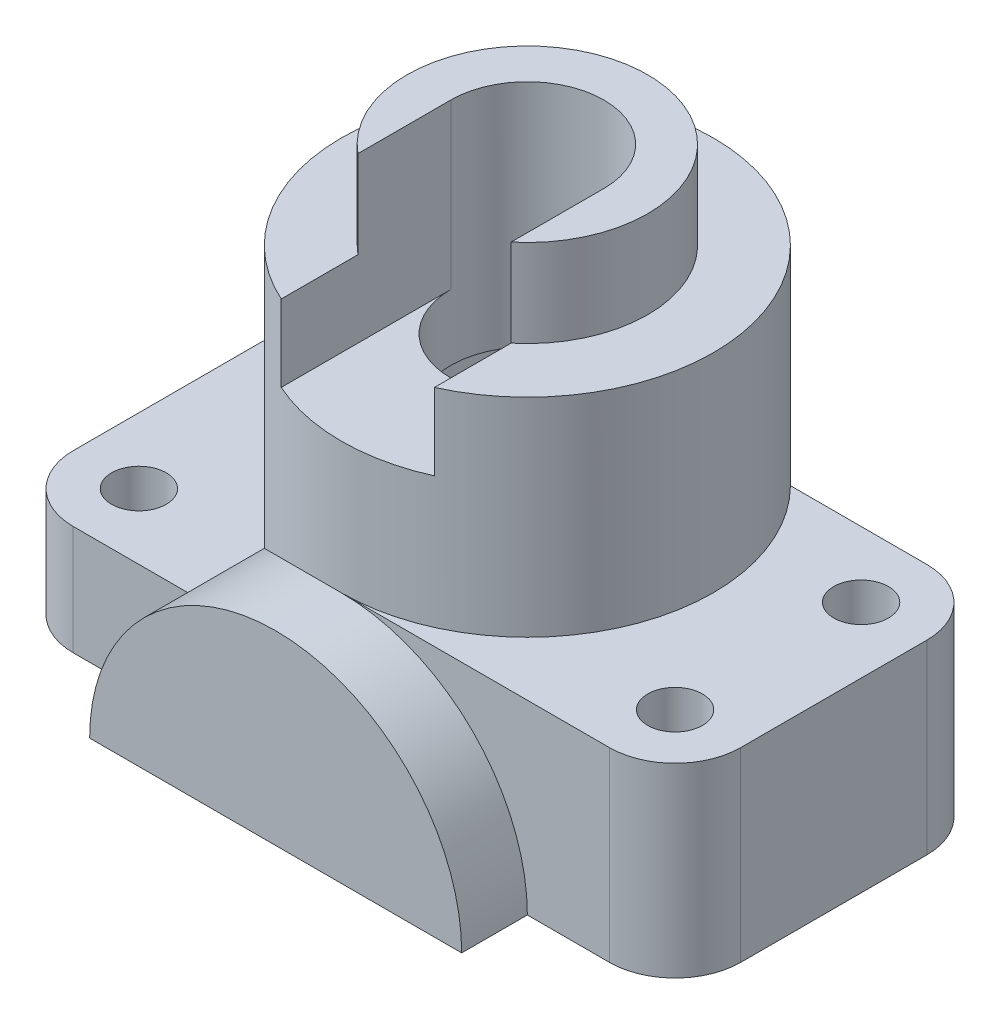
ISO-10303-21;
HEADER;
FILE_DESCRIPTION(('STEP AP214'),'2;1');
FILE_NAME('part.step','',(''),(''),'','','');
FILE_SCHEMA(('AUTOMOTIVE_DESIGN { 1 0 10303 214 1 1 1 1 }'));
ENDSEC;
DATA;
#1=APPLICATION_CONTEXT('core data for automotive mechanical design processes');
#2=APPLICATION_PROTOCOL_DEFINITION('international standard','automotive_design',2000,#1);
#3=PRODUCT_CONTEXT('',#1,'mechanical');
#4=PRODUCT('Part','Part','',(#3));
#5=PRODUCT_RELATED_PRODUCT_CATEGORY('part','',(#4));
#6=PRODUCT_DEFINITION_FORMATION('','',#4);
#7=PRODUCT_DEFINITION_CONTEXT('part definition',#1,'design');
#8=PRODUCT_DEFINITION('design','',#6,#7);
#9=PRODUCT_DEFINITION_SHAPE('','',#8);
#10=(LENGTH_UNIT() NAMED_UNIT(*) SI_UNIT(.MILLI.,.METRE.));
#11=(NAMED_UNIT(*) PLANE_ANGLE_UNIT() SI_UNIT($,.RADIAN.));
#12=(NAMED_UNIT(*) SI_UNIT($,.STERADIAN.) SOLID_ANGLE_UNIT());
#13=UNCERTAINTY_MEASURE_WITH_UNIT(LENGTH_MEASURE(1.E-05),#10,'distance_accuracy_value','');
#14=(GEOMETRIC_REPRESENTATION_CONTEXT(3) GLOBAL_UNCERTAINTY_ASSIGNED_CONTEXT((#13)) GLOBAL_UNIT_ASSIGNED_CONTEXT((#10,
#11,#12)) REPRESENTATION_CONTEXT('',''));
#15=CARTESIAN_POINT('',(0.,0.,0.));
#16=DIRECTION('',(0.,0.,1.));
#17=DIRECTION('',(1.,0.,0.));
#18=AXIS2_PLACEMENT_3D('',#15,#16,#17);
#19=CARTESIAN_POINT('',(0.,36.,0.));
#20=DIRECTION('',(0.,-1.,0.));
#21=DIRECTION('',(0.,0.,-1.));
#22=AXIS2_PLACEMENT_3D('',#19,#20,#21);
#23=CYLINDRICAL_SURFACE('',#22,17.);
#24=DIRECTION('',(0.,-1.,0.));
#25=VECTOR('',#24,1.);
#26=CARTESIAN_POINT('',(6.99999999999999,36.,15.4919333848297));
#27=LINE('',#26,#25);
#28=CARTESIAN_POINT('',(6.99999999999999,29.,15.4919333848297));
#29=VERTEX_POINT('',#28);
#30=CARTESIAN_POINT('',(6.99999999999999,36.,15.4919333848297));
#31=VERTEX_POINT('',#30);
#32=EDGE_CURVE('E369',#29,#31,#27,.F.);
#33=ORIENTED_EDGE('',*,*,#32,.F.);
#34=CARTESIAN_POINT('',(0.,29.,0.));
#35=DIRECTION('',(0.,1.,0.));
#36=DIRECTION('',(0.,0.,1.));
#37=AXIS2_PLACEMENT_3D('',#34,#35,#36);
#38=CIRCLE('',#37,17.);
#39=CARTESIAN_POINT('',(-7.,29.,15.4919333848297));
#40=VERTEX_POINT('',#39);
#41=EDGE_CURVE('E353',#40,#29,#38,.T.);
#42=ORIENTED_EDGE('',*,*,#41,.F.);
#43=DIRECTION('',(0.,-1.,0.));
#44=VECTOR('',#43,1.);
#45=CARTESIAN_POINT('',(-7.00000000000001,36.,15.4919333848297));
#46=LINE('',#45,#44);
#47=CARTESIAN_POINT('',(-7.00000000000001,36.,15.4919333848297));
#48=VERTEX_POINT('',#47);
#49=EDGE_CURVE('E361',#48,#40,#46,.T.);
#50=ORIENTED_EDGE('',*,*,#49,.F.);
#51=CARTESIAN_POINT('',(0.,36.,0.));
#52=DIRECTION('',(0.,1.,0.));
#53=DIRECTION('',(0.,0.,1.));
#54=AXIS2_PLACEMENT_3D('',#51,#52,#53);
#55=CIRCLE('',#54,17.);
#56=EDGE_CURVE('E380',#31,#48,#55,.T.);
#57=ORIENTED_EDGE('',*,*,#56,.F.);
#58=EDGE_LOOP('',(#33,#42,#50,#57));
#59=FACE_BOUND('',#58,.T.);
#60=DIRECTION('',(0.,-1.,0.));
#61=VECTOR('',#60,1.);
#62=CARTESIAN_POINT('',(-12.0415945787923,23.,-12.));
#63=LINE('',#62,#61);
#64=CARTESIAN_POINT('',(-12.0415945787923,23.,-12.));
#65=VERTEX_POINT('',#64);
#66=CARTESIAN_POINT('',(-12.0415945787923,10.,-12.));
#67=VERTEX_POINT('',#66);
#68=EDGE_CURVE('E198',#65,#67,#63,.T.);
#69=ORIENTED_EDGE('',*,*,#68,.T.);
#70=CARTESIAN_POINT('',(0.,10.,0.));
#71=DIRECTION('',(0.,1.,0.));
#72=DIRECTION('',(0.,0.,1.));
#73=AXIS2_PLACEMENT_3D('',#70,#71,#72);
#74=CIRCLE('',#73,17.);
#75=CARTESIAN_POINT('',(-13.7477270848675,10.,10.));
#76=VERTEX_POINT('',#75);
#77=EDGE_CURVE('E11',#67,#76,#74,.T.);
#78=ORIENTED_EDGE('',*,*,#77,.T.);
#79=CARTESIAN_POINT('',(0.,0.,0.));
#80=DIRECTION('',(0.,-0.707106781186547,0.707106781186547));
#81=DIRECTION('',(0.,-0.707106781186547,-0.707106781186547));
#82=AXIS2_PLACEMENT_3D('',#79,#80,#81);
#83=ELLIPSE('',#82,24.0416305603426,17.);
#84=CARTESIAN_POINT('',(0.,17.,17.));
#85=VERTEX_POINT('',#84);
#86=EDGE_CURVE('E335',#76,#85,#83,.F.);
#87=ORIENTED_EDGE('',*,*,#86,.T.);
#88=CARTESIAN_POINT('',(0.,17.,0.));
#89=DIRECTION('',(0.,1.,0.));
#90=DIRECTION('',(0.,0.,1.));
#91=AXIS2_PLACEMENT_3D('',#88,#89,#90);
#92=CIRCLE('',#91,17.);
#93=CARTESIAN_POINT('',(12.0415945787923,17.,-12.));
#94=VERTEX_POINT('',#93);
#95=EDGE_CURVE('E321',#85,#94,#92,.T.);
#96=ORIENTED_EDGE('',*,*,#95,.T.);
#97=DIRECTION('',(0.,-1.,0.));
#98=VECTOR('',#97,1.);
#99=CARTESIAN_POINT('',(12.0415945787923,23.,-12.));
#100=LINE('',#99,#98);
#101=CARTESIAN_POINT('',(12.0415945787923,23.,-12.));
#102=VERTEX_POINT('',#101);
#103=EDGE_CURVE('E206',#102,#94,#100,.T.);
#104=ORIENTED_EDGE('',*,*,#103,.F.);
#105=CARTESIAN_POINT('',(0.,23.,0.));
#106=DIRECTION('',(0.,1.,0.));
#107=DIRECTION('',(0.,0.,1.));
#108=AXIS2_PLACEMENT_3D('',#105,#106,#107);
#109=CIRCLE('',#108,17.);
#110=EDGE_CURVE('E192',#102,#65,#109,.T.);
#111=ORIENTED_EDGE('',*,*,#110,.T.);
#112=EDGE_LOOP('',(#69,#78,#87,#96,#104,#111));
#113=FACE_BOUND('',#112,.T.);
#114=ADVANCED_FACE('F37',(#59,#113),#23,.T.);
#115=CARTESIAN_POINT('',(0.,0.,0.));
#116=DIRECTION('',(0.,1.,0.));
#117=DIRECTION('',(0.,0.,1.));
#118=AXIS2_PLACEMENT_3D('',#115,#116,#117);
#119=PLANE('',#118);
#120=CARTESIAN_POINT('',(-24.5,0.,-6.));
#121=DIRECTION('',(0.,1.,0.));
#122=DIRECTION('',(0.,0.,1.));
#123=AXIS2_PLACEMENT_3D('',#120,#121,#122);
#124=CIRCLE('',#123,2.5);
#125=CARTESIAN_POINT('',(-24.5,0.,-3.5));
#126=VERTEX_POINT('',#125);
#127=EDGE_CURVE('E228',#126,#126,#124,.T.);
#128=ORIENTED_EDGE('',*,*,#127,.T.);
#129=EDGE_LOOP('',(#128));
#130=FACE_BOUND('',#129,.T.);
#131=CARTESIAN_POINT('',(-24.5,0.,11.));
#132=DIRECTION('',(0.,1.,0.));
#133=DIRECTION('',(0.,0.,1.));
#134=AXIS2_PLACEMENT_3D('',#131,#132,#133);
#135=CIRCLE('',#134,2.5);
#136=CARTESIAN_POINT('',(-24.5,0.,13.5));
#137=VERTEX_POINT('',#136);
#138=EDGE_CURVE('E229',#137,#137,#135,.T.);
#139=ORIENTED_EDGE('',*,*,#138,.T.);
#140=EDGE_LOOP('',(#139));
#141=FACE_BOUND('',#140,.T.);
#142=CARTESIAN_POINT('',(24.5,0.,-6.));
#143=DIRECTION('',(0.,1.,0.));
#144=DIRECTION('',(0.,0.,1.));
#145=AXIS2_PLACEMENT_3D('',#142,#143,#144);
#146=CIRCLE('',#145,2.5);
#147=CARTESIAN_POINT('',(24.5,0.,-3.5));
#148=VERTEX_POINT('',#147);
#149=EDGE_CURVE('E279',#148,#148,#146,.T.);
#150=ORIENTED_EDGE('',*,*,#149,.T.);
#151=EDGE_LOOP('',(#150));
#152=FACE_BOUND('',#151,.T.);
#153=CARTESIAN_POINT('',(24.5,0.,11.));
#154=DIRECTION('',(0.,1.,0.));
#155=DIRECTION('',(0.,0.,1.));
#156=AXIS2_PLACEMENT_3D('',#153,#154,#155);
#157=CIRCLE('',#156,2.5);
#158=CARTESIAN_POINT('',(24.5,0.,13.5));
#159=VERTEX_POINT('',#158);
#160=EDGE_CURVE('E275',#159,#159,#157,.T.);
#161=ORIENTED_EDGE('',*,*,#160,.T.);
#162=EDGE_LOOP('',(#161));
#163=FACE_BOUND('',#162,.T.);
#164=DIRECTION('',(0.,0.,1.));
#165=VECTOR('',#164,1.);
#166=CARTESIAN_POINT('',(-12.0415945787923,0.,-12.));
#167=LINE('',#166,#165);
#168=CARTESIAN_POINT('',(-12.0415945787923,0.,-12.));
#169=VERTEX_POINT('',#168);
#170=CARTESIAN_POINT('',(-12.0415945787923,0.,0.));
#171=VERTEX_POINT('',#170);
#172=EDGE_CURVE('E216',#169,#171,#167,.T.);
#173=ORIENTED_EDGE('',*,*,#172,.T.);
#174=CARTESIAN_POINT('',(0.,0.,0.));
#175=DIRECTION('',(0.,1.,0.));
#176=DIRECTION('',(0.,0.,1.));
#177=AXIS2_PLACEMENT_3D('',#174,#175,#176);
#178=CIRCLE('',#177,12.0415945787923);
#179=CARTESIAN_POINT('',(12.0415945787923,0.,0.));
#180=VERTEX_POINT('',#179);
#181=EDGE_CURVE('E210',#171,#180,#178,.T.);
#182=ORIENTED_EDGE('',*,*,#181,.T.);
#183=DIRECTION('',(0.,0.,-1.));
#184=VECTOR('',#183,1.);
#185=CARTESIAN_POINT('',(12.0415945787923,0.,-12.));
#186=LINE('',#185,#184);
#187=CARTESIAN_POINT('',(12.0415945787923,0.,-12.));
#188=VERTEX_POINT('',#187);
#189=EDGE_CURVE('E207',#180,#188,#186,.T.);
#190=ORIENTED_EDGE('',*,*,#189,.T.);
#191=DIRECTION('',(-1.,0.,0.));
#192=VECTOR('',#191,1.);
#193=CARTESIAN_POINT('',(0.,0.,-12.));
#194=LINE('',#193,#192);
#195=CARTESIAN_POINT('',(24.5,0.,-12.));
#196=VERTEX_POINT('',#195);
#197=EDGE_CURVE('E285',#196,#188,#194,.T.);
#198=ORIENTED_EDGE('',*,*,#197,.F.);
#199=CARTESIAN_POINT('',(24.5,0.,-6.));
#200=DIRECTION('',(0.,1.,0.));
#201=DIRECTION('',(0.,0.,1.));
#202=AXIS2_PLACEMENT_3D('',#199,#200,#201);
#203=CIRCLE('',#202,6.);
#204=CARTESIAN_POINT('',(30.5,0.,-6.));
#205=VERTEX_POINT('',#204);
#206=EDGE_CURVE('E292',#205,#196,#203,.T.);
#207=ORIENTED_EDGE('',*,*,#206,.F.);
#208=DIRECTION('',(0.,0.,-1.));
#209=VECTOR('',#208,1.);
#210=CARTESIAN_POINT('',(30.5,0.,11.));
#211=LINE('',#210,#209);
#212=CARTESIAN_POINT('',(30.5,0.,11.));
#213=VERTEX_POINT('',#212);
#214=EDGE_CURVE('E307',#213,#205,#211,.T.);
#215=ORIENTED_EDGE('',*,*,#214,.F.);
#216=CARTESIAN_POINT('',(24.5,0.,11.));
#217=DIRECTION('',(0.,1.,0.));
#218=DIRECTION('',(0.,0.,1.));
#219=AXIS2_PLACEMENT_3D('',#216,#217,#218);
#220=CIRCLE('',#219,6.);
#221=CARTESIAN_POINT('',(24.5,0.,17.));
#222=VERTEX_POINT('',#221);
#223=EDGE_CURVE('E305',#222,#213,#220,.T.);
#224=ORIENTED_EDGE('',*,*,#223,.F.);
#225=DIRECTION('',(1.,0.,0.));
#226=VECTOR('',#225,1.);
#227=CARTESIAN_POINT('',(0.,0.,17.));
#228=LINE('',#227,#226);
#229=CARTESIAN_POINT('',(17.,0.,17.));
#230=VERTEX_POINT('',#229);
#231=EDGE_CURVE('E303',#230,#222,#228,.T.);
#232=ORIENTED_EDGE('',*,*,#231,.F.);
#233=DIRECTION('',(0.,0.,1.));
#234=VECTOR('',#233,1.);
#235=CARTESIAN_POINT('',(17.,0.,0.));
#236=LINE('',#235,#234);
#237=CARTESIAN_POINT('',(17.,0.,23.));
#238=VERTEX_POINT('',#237);
#239=EDGE_CURVE('E333',#230,#238,#236,.T.);
#240=ORIENTED_EDGE('',*,*,#239,.T.);
#241=DIRECTION('',(1.,0.,0.));
#242=VECTOR('',#241,1.);
#243=CARTESIAN_POINT('',(-17.,0.,23.));
#244=LINE('',#243,#242);
#245=CARTESIAN_POINT('',(-17.,0.,23.));
#246=VERTEX_POINT('',#245);
#247=EDGE_CURVE('E329',#246,#238,#244,.T.);
#248=ORIENTED_EDGE('',*,*,#247,.F.);
#249=DIRECTION('',(0.,0.,1.));
#250=VECTOR('',#249,1.);
#251=CARTESIAN_POINT('',(-17.,0.,0.));
#252=LINE('',#251,#250);
#253=CARTESIAN_POINT('',(-17.,0.,17.));
#254=VERTEX_POINT('',#253);
#255=EDGE_CURVE('E332',#254,#246,#252,.T.);
#256=ORIENTED_EDGE('',*,*,#255,.F.);
#257=DIRECTION('',(1.,0.,0.));
#258=VECTOR('',#257,1.);
#259=CARTESIAN_POINT('',(-24.5,0.,17.));
#260=LINE('',#259,#258);
#261=CARTESIAN_POINT('',(-24.5,0.,17.));
#262=VERTEX_POINT('',#261);
#263=EDGE_CURVE('E241',#262,#254,#260,.T.);
#264=ORIENTED_EDGE('',*,*,#263,.F.);
#265=CARTESIAN_POINT('',(-24.5,0.,11.));
#266=DIRECTION('',(0.,1.,0.));
#267=DIRECTION('',(0.,0.,1.));
#268=AXIS2_PLACEMENT_3D('',#265,#266,#267);
#269=CIRCLE('',#268,6.);
#270=CARTESIAN_POINT('',(-30.5,0.,11.));
#271=VERTEX_POINT('',#270);
#272=EDGE_CURVE('E256',#271,#262,#269,.T.);
#273=ORIENTED_EDGE('',*,*,#272,.F.);
#274=DIRECTION('',(0.,0.,1.));
#275=VECTOR('',#274,1.);
#276=CARTESIAN_POINT('',(-30.5,0.,11.));
#277=LINE('',#276,#275);
#278=CARTESIAN_POINT('',(-30.5,0.,-6.));
#279=VERTEX_POINT('',#278);
#280=EDGE_CURVE('E254',#279,#271,#277,.T.);
#281=ORIENTED_EDGE('',*,*,#280,.F.);
#282=CARTESIAN_POINT('',(-24.5,0.,-6.));
#283=DIRECTION('',(0.,1.,0.));
#284=DIRECTION('',(0.,0.,-1.));
#285=AXIS2_PLACEMENT_3D('',#282,#283,#284);
#286=CIRCLE('',#285,6.);
#287=CARTESIAN_POINT('',(-24.5,0.,-12.));
#288=VERTEX_POINT('',#287);
#289=EDGE_CURVE('E252',#288,#279,#286,.T.);
#290=ORIENTED_EDGE('',*,*,#289,.F.);
#291=DIRECTION('',(-1.,0.,0.));
#292=VECTOR('',#291,1.);
#293=CARTESIAN_POINT('',(-24.5,0.,-12.));
#294=LINE('',#293,#292);
#295=EDGE_CURVE('E235',#169,#288,#294,.T.);
#296=ORIENTED_EDGE('',*,*,#295,.F.);
#297=EDGE_LOOP('',(#173,#182,#190,#198,#207,#215,#224,#232,#240,#248,#256,#264,#273,#281,#290,#296));
#298=FACE_BOUND('',#297,.T.);
#299=ADVANCED_FACE('F399',(#130,#141,#152,#163,#298),#119,.F.);
#300=CARTESIAN_POINT('',(0.,0.,0.));
#301=DIRECTION('',(0.,0.,1.));
#302=DIRECTION('',(1.,0.,0.));
#303=AXIS2_PLACEMENT_3D('',#300,#301,#302);
#304=CYLINDRICAL_SURFACE('',#303,17.);
#305=DIRECTION('',(0.,0.,1.));
#306=VECTOR('',#305,1.);
#307=CARTESIAN_POINT('',(-13.7477270848675,10.,0.));
#308=LINE('',#307,#306);
#309=CARTESIAN_POINT('',(-13.7477270848675,10.,17.));
#310=VERTEX_POINT('',#309);
#311=EDGE_CURVE('E51',#310,#76,#308,.F.);
#312=ORIENTED_EDGE('',*,*,#311,.F.);
#313=CARTESIAN_POINT('',(0.,0.,17.));
#314=DIRECTION('',(0.,0.,-1.));
#315=DIRECTION('',(-1.,0.,0.));
#316=AXIS2_PLACEMENT_3D('',#313,#314,#315);
#317=CIRCLE('',#316,17.);
#318=EDGE_CURVE('E271',#310,#254,#317,.F.);
#319=ORIENTED_EDGE('',*,*,#318,.T.);
#320=ORIENTED_EDGE('',*,*,#255,.T.);
#321=CARTESIAN_POINT('',(0.,0.,23.));
#322=DIRECTION('',(0.,0.,1.));
#323=DIRECTION('',(1.,0.,0.));
#324=AXIS2_PLACEMENT_3D('',#321,#322,#323);
#325=CIRCLE('',#324,17.);
#326=EDGE_CURVE('E326',#238,#246,#325,.T.);
#327=ORIENTED_EDGE('',*,*,#326,.F.);
#328=ORIENTED_EDGE('',*,*,#239,.F.);
#329=CARTESIAN_POINT('',(0.,0.,17.));
#330=DIRECTION('',(0.,0.,-1.));
#331=DIRECTION('',(-1.,0.,0.));
#332=AXIS2_PLACEMENT_3D('',#329,#330,#331);
#333=CIRCLE('',#332,17.);
#334=EDGE_CURVE('E44',#230,#85,#333,.F.);
#335=ORIENTED_EDGE('',*,*,#334,.T.);
#336=ORIENTED_EDGE('',*,*,#86,.F.);
#337=EDGE_LOOP('',(#312,#319,#320,#327,#328,#335,#336));
#338=FACE_BOUND('',#337,.T.);
#339=ADVANCED_FACE('F389',(#338),#304,.T.);
#340=CARTESIAN_POINT('',(0.,36.,0.));
#341=DIRECTION('',(0.,1.,0.));
#342=DIRECTION('',(0.,0.,1.));
#343=AXIS2_PLACEMENT_3D('',#340,#341,#342);
#344=PLANE('',#343);
#345=CARTESIAN_POINT('',(0.,36.,0.));
#346=DIRECTION('',(0.,1.,0.));
#347=DIRECTION('',(0.,0.,1.));
#348=AXIS2_PLACEMENT_3D('',#345,#346,#347);
#349=CIRCLE('',#348,11.);
#350=CARTESIAN_POINT('',(-7.,36.,8.48528137423857));
#351=VERTEX_POINT('',#350);
#352=CARTESIAN_POINT('',(6.99999999999999,36.,8.48528137423857));
#353=VERTEX_POINT('',#352);
#354=EDGE_CURVE('E376',#351,#353,#349,.F.);
#355=ORIENTED_EDGE('',*,*,#354,.T.);
#356=DIRECTION('',(0.,0.,1.));
#357=VECTOR('',#356,1.);
#358=CARTESIAN_POINT('',(6.99999999999999,36.,0.));
#359=LINE('',#358,#357);
#360=EDGE_CURVE('E366',#353,#31,#359,.T.);
#361=ORIENTED_EDGE('',*,*,#360,.T.);
#362=ORIENTED_EDGE('',*,*,#56,.T.);
#363=DIRECTION('',(0.,0.,-1.));
#364=VECTOR('',#363,1.);
#365=CARTESIAN_POINT('',(-7.00000000000001,36.,0.));
#366=LINE('',#365,#364);
#367=EDGE_CURVE('E358',#48,#351,#366,.T.);
#368=ORIENTED_EDGE('',*,*,#367,.T.);
#369=EDGE_LOOP('',(#355,#361,#362,#368));
#370=FACE_BOUND('',#369,.T.);
#371=ADVANCED_FACE('F478',(#370),#344,.T.);
#372=CARTESIAN_POINT('',(0.,-0.002000000000002,0.));
#373=DIRECTION('',(0.,1.,0.));
#374=DIRECTION('',(0.,0.,1.));
#375=AXIS2_PLACEMENT_3D('',#372,#373,#374);
#376=CYLINDRICAL_SURFACE('',#375,11.);
#377=CARTESIAN_POINT('',(0.,44.,0.));
#378=DIRECTION('',(0.,1.,0.));
#379=DIRECTION('',(0.,0.,1.));
#380=AXIS2_PLACEMENT_3D('',#377,#378,#379);
#381=CIRCLE('',#380,11.);
#382=CARTESIAN_POINT('',(6.99999999999999,44.,8.48528137423858));
#383=VERTEX_POINT('',#382);
#384=CARTESIAN_POINT('',(-7.00000000000001,44.,8.48528137423856));
#385=VERTEX_POINT('',#384);
#386=EDGE_CURVE('E377',#383,#385,#381,.T.);
#387=ORIENTED_EDGE('',*,*,#386,.F.);
#388=DIRECTION('',(0.,1.,0.));
#389=VECTOR('',#388,1.);
#390=CARTESIAN_POINT('',(6.99999999999999,-0.00200000000000119,8.48528137423857));
#391=LINE('',#390,#389);
#392=EDGE_CURVE('E363',#383,#353,#391,.F.);
#393=ORIENTED_EDGE('',*,*,#392,.T.);
#394=ORIENTED_EDGE('',*,*,#354,.F.);
#395=DIRECTION('',(0.,1.,0.));
#396=VECTOR('',#395,1.);
#397=CARTESIAN_POINT('',(-7.,-0.00200000000000281,8.48528137423857));
#398=LINE('',#397,#396);
#399=EDGE_CURVE('E355',#351,#385,#398,.T.);
#400=ORIENTED_EDGE('',*,*,#399,.T.);
#401=EDGE_LOOP('',(#387,#393,#394,#400));
#402=FACE_BOUND('',#401,.T.);
#403=ADVANCED_FACE('F482',(#402),#376,.T.);
#404=CARTESIAN_POINT('',(0.,44.,0.));
#405=DIRECTION('',(0.,1.,0.));
#406=DIRECTION('',(0.,0.,1.));
#407=AXIS2_PLACEMENT_3D('',#404,#405,#406);
#408=PLANE('',#407);
#409=CARTESIAN_POINT('',(0.,44.,0.));
#410=DIRECTION('',(0.,1.,0.));
#411=DIRECTION('',(0.,0.,1.));
#412=AXIS2_PLACEMENT_3D('',#409,#410,#411);
#413=CIRCLE('',#412,7.);
#414=CARTESIAN_POINT('',(6.99999999999999,44.,0.));
#415=VERTEX_POINT('',#414);
#416=CARTESIAN_POINT('',(-7.00000000000001,44.,0.));
#417=VERTEX_POINT('',#416);
#418=EDGE_CURVE('E371',#415,#417,#413,.T.);
#419=ORIENTED_EDGE('',*,*,#418,.F.);
#420=DIRECTION('',(0.,0.,-1.));
#421=VECTOR('',#420,1.);
#422=CARTESIAN_POINT('',(6.99999999999999,44.,21.));
#423=LINE('',#422,#421);
#424=EDGE_CURVE('E351',#383,#415,#423,.T.);
#425=ORIENTED_EDGE('',*,*,#424,.F.);
#426=ORIENTED_EDGE('',*,*,#386,.T.);
#427=DIRECTION('',(0.,0.,-1.));
#428=VECTOR('',#427,1.);
#429=CARTESIAN_POINT('',(-7.00000000000001,44.,21.));
#430=LINE('',#429,#428);
#431=EDGE_CURVE('E348',#385,#417,#430,.T.);
#432=ORIENTED_EDGE('',*,*,#431,.T.);
#433=EDGE_LOOP('',(#419,#425,#426,#432));
#434=FACE_BOUND('',#433,.T.);
#435=ADVANCED_FACE('F486',(#434),#408,.T.);
#436=CARTESIAN_POINT('',(0.,23.,0.));
#437=DIRECTION('',(0.,1.,0.));
#438=DIRECTION('',(0.,0.,1.));
#439=AXIS2_PLACEMENT_3D('',#436,#437,#438);
#440=CYLINDRICAL_SURFACE('',#439,7.);
#441=CARTESIAN_POINT('',(0.,23.,0.));
#442=DIRECTION('',(0.,1.,0.));
#443=DIRECTION('',(0.,0.,1.));
#444=AXIS2_PLACEMENT_3D('',#441,#442,#443);
#445=CIRCLE('',#444,7.);
#446=CARTESIAN_POINT('',(0.,23.,7.));
#447=VERTEX_POINT('',#446);
#448=EDGE_CURVE('E202',#447,#447,#445,.T.);
#449=ORIENTED_EDGE('',*,*,#448,.F.);
#450=EDGE_LOOP('',(#449));
#451=FACE_BOUND('',#450,.T.);
#452=DIRECTION('',(0.,1.,0.));
#453=VECTOR('',#452,1.);
#454=CARTESIAN_POINT('',(6.99999999999999,44.,0.));
#455=LINE('',#454,#453);
#456=CARTESIAN_POINT('',(6.99999999999999,29.,0.));
#457=VERTEX_POINT('',#456);
#458=EDGE_CURVE('E338',#457,#415,#455,.T.);
#459=ORIENTED_EDGE('',*,*,#458,.T.);
#460=ORIENTED_EDGE('',*,*,#418,.T.);
#461=DIRECTION('',(0.,-1.,0.));
#462=VECTOR('',#461,1.);
#463=CARTESIAN_POINT('',(-7.00000000000001,44.,0.));
#464=LINE('',#463,#462);
#465=CARTESIAN_POINT('',(-7.,29.,0.));
#466=VERTEX_POINT('',#465);
#467=EDGE_CURVE('E341',#417,#466,#464,.T.);
#468=ORIENTED_EDGE('',*,*,#467,.T.);
#469=CARTESIAN_POINT('',(0.,29.,0.));
#470=DIRECTION('',(0.,1.,0.));
#471=DIRECTION('',(0.,0.,1.));
#472=AXIS2_PLACEMENT_3D('',#469,#470,#471);
#473=CIRCLE('',#472,7.);
#474=EDGE_CURVE('E385',#457,#466,#473,.F.);
#475=ORIENTED_EDGE('',*,*,#474,.F.);
#476=EDGE_LOOP('',(#459,#460,#468,#475));
#477=FACE_BOUND('',#476,.T.);
#478=ADVANCED_FACE('F488',(#451,#477),#440,.F.);
#479=CARTESIAN_POINT('',(6.99999999999999,44.,21.));
#480=DIRECTION('',(-1.,0.,0.));
#481=DIRECTION('',(0.,-1.,0.));
#482=AXIS2_PLACEMENT_3D('',#479,#480,#481);
#483=PLANE('',#482);
#484=ORIENTED_EDGE('',*,*,#32,.T.);
#485=ORIENTED_EDGE('',*,*,#360,.F.);
#486=ORIENTED_EDGE('',*,*,#392,.F.);
#487=ORIENTED_EDGE('',*,*,#424,.T.);
#488=ORIENTED_EDGE('',*,*,#458,.F.);
#489=DIRECTION('',(0.,0.,-1.));
#490=VECTOR('',#489,1.);
#491=CARTESIAN_POINT('',(6.99999999999999,29.,21.));
#492=LINE('',#491,#490);
#493=EDGE_CURVE('E344',#29,#457,#492,.T.);
#494=ORIENTED_EDGE('',*,*,#493,.F.);
#495=EDGE_LOOP('',(#484,#485,#486,#487,#488,#494));
#496=FACE_BOUND('',#495,.T.);
#497=ADVANCED_FACE('F475',(#496),#483,.T.);
#498=CARTESIAN_POINT('',(-7.00000000000001,44.,21.));
#499=DIRECTION('',(1.,0.,0.));
#500=DIRECTION('',(0.,1.,0.));
#501=AXIS2_PLACEMENT_3D('',#498,#499,#500);
#502=PLANE('',#501);
#503=ORIENTED_EDGE('',*,*,#49,.T.);
#504=DIRECTION('',(0.,0.,-1.));
#505=VECTOR('',#504,1.);
#506=CARTESIAN_POINT('',(-7.00000000000001,29.,21.));
#507=LINE('',#506,#505);
#508=EDGE_CURVE('E346',#40,#466,#507,.T.);
#509=ORIENTED_EDGE('',*,*,#508,.T.);
#510=ORIENTED_EDGE('',*,*,#467,.F.);
#511=ORIENTED_EDGE('',*,*,#431,.F.);
#512=ORIENTED_EDGE('',*,*,#399,.F.);
#513=ORIENTED_EDGE('',*,*,#367,.F.);
#514=EDGE_LOOP('',(#503,#509,#510,#511,#512,#513));
#515=FACE_BOUND('',#514,.T.);
#516=ADVANCED_FACE('F459',(#515),#502,.T.);
#517=CARTESIAN_POINT('',(-7.00000000000001,29.,21.));
#518=DIRECTION('',(0.,1.,0.));
#519=DIRECTION('',(0.,0.,1.));
#520=AXIS2_PLACEMENT_3D('',#517,#518,#519);
#521=PLANE('',#520);
#522=ORIENTED_EDGE('',*,*,#41,.T.);
#523=ORIENTED_EDGE('',*,*,#493,.T.);
#524=ORIENTED_EDGE('',*,*,#474,.T.);
#525=ORIENTED_EDGE('',*,*,#508,.F.);
#526=EDGE_LOOP('',(#522,#523,#524,#525));
#527=FACE_BOUND('',#526,.T.);
#528=ADVANCED_FACE('F452',(#527),#521,.T.);
#529=CARTESIAN_POINT('',(0.,0.,23.));
#530=DIRECTION('',(0.,0.,1.));
#531=DIRECTION('',(1.,0.,0.));
#532=AXIS2_PLACEMENT_3D('',#529,#530,#531);
#533=PLANE('',#532);
#534=ORIENTED_EDGE('',*,*,#326,.T.);
#535=ORIENTED_EDGE('',*,*,#247,.T.);
#536=EDGE_LOOP('',(#534,#535));
#537=FACE_BOUND('',#536,.T.);
#538=ADVANCED_FACE('F450',(#537),#533,.T.);
#539=CARTESIAN_POINT('',(0.,17.,-12.));
#540=DIRECTION('',(0.,0.,1.));
#541=DIRECTION('',(1.,0.,0.));
#542=AXIS2_PLACEMENT_3D('',#539,#540,#541);
#543=PLANE('',#542);
#544=ORIENTED_EDGE('',*,*,#197,.T.);
#545=DIRECTION('',(0.,-1.,0.));
#546=VECTOR('',#545,1.);
#547=CARTESIAN_POINT('',(12.0415945787923,36.,-12.));
#548=LINE('',#547,#546);
#549=EDGE_CURVE('E323',#188,#94,#548,.F.);
#550=ORIENTED_EDGE('',*,*,#549,.T.);
#551=DIRECTION('',(-1.,0.,0.));
#552=VECTOR('',#551,1.);
#553=CARTESIAN_POINT('',(0.,17.,-12.));
#554=LINE('',#553,#552);
#555=CARTESIAN_POINT('',(24.5,17.,-12.));
#556=VERTEX_POINT('',#555);
#557=EDGE_CURVE('E288',#556,#94,#554,.T.);
#558=ORIENTED_EDGE('',*,*,#557,.F.);
#559=DIRECTION('',(0.,-1.,0.));
#560=VECTOR('',#559,1.);
#561=CARTESIAN_POINT('',(24.5,17.,-12.));
#562=LINE('',#561,#560);
#563=EDGE_CURVE('E300',#556,#196,#562,.T.);
#564=ORIENTED_EDGE('',*,*,#563,.T.);
#565=EDGE_LOOP('',(#544,#550,#558,#564));
#566=FACE_BOUND('',#565,.T.);
#567=ADVANCED_FACE('F417',(#566),#543,.F.);
#568=CARTESIAN_POINT('',(24.5,17.,-6.));
#569=DIRECTION('',(0.,1.,0.));
#570=DIRECTION('',(0.,0.,1.));
#571=AXIS2_PLACEMENT_3D('',#568,#569,#570);
#572=PLANE('',#571);
#573=CARTESIAN_POINT('',(24.5,17.,11.));
#574=DIRECTION('',(0.,1.,0.));
#575=DIRECTION('',(0.,0.,1.));
#576=AXIS2_PLACEMENT_3D('',#573,#574,#575);
#577=CIRCLE('',#576,2.5);
#578=CARTESIAN_POINT('',(24.5,17.,13.5));
#579=VERTEX_POINT('',#578);
#580=EDGE_CURVE('E276',#579,#579,#577,.T.);
#581=ORIENTED_EDGE('',*,*,#580,.F.);
#582=EDGE_LOOP('',(#581));
#583=FACE_BOUND('',#582,.T.);
#584=CARTESIAN_POINT('',(24.5,17.,-6.));
#585=DIRECTION('',(0.,1.,0.));
#586=DIRECTION('',(0.,0.,1.));
#587=AXIS2_PLACEMENT_3D('',#584,#585,#586);
#588=CIRCLE('',#587,2.5);
#589=CARTESIAN_POINT('',(24.5,17.,-3.5));
#590=VERTEX_POINT('',#589);
#591=EDGE_CURVE('E282',#590,#590,#588,.T.);
#592=ORIENTED_EDGE('',*,*,#591,.F.);
#593=EDGE_LOOP('',(#592));
#594=FACE_BOUND('',#593,.T.);
#595=ORIENTED_EDGE('',*,*,#95,.F.);
#596=DIRECTION('',(1.,0.,0.));
#597=VECTOR('',#596,1.);
#598=CARTESIAN_POINT('',(0.,17.,17.));
#599=LINE('',#598,#597);
#600=CARTESIAN_POINT('',(24.5,17.,17.));
#601=VERTEX_POINT('',#600);
#602=EDGE_CURVE('E291',#85,#601,#599,.T.);
#603=ORIENTED_EDGE('',*,*,#602,.T.);
#604=CARTESIAN_POINT('',(24.5,17.,11.));
#605=DIRECTION('',(0.,1.,0.));
#606=DIRECTION('',(0.,0.,1.));
#607=AXIS2_PLACEMENT_3D('',#604,#605,#606);
#608=CIRCLE('',#607,6.);
#609=CARTESIAN_POINT('',(30.5,17.,11.));
#610=VERTEX_POINT('',#609);
#611=EDGE_CURVE('E294',#601,#610,#608,.T.);
#612=ORIENTED_EDGE('',*,*,#611,.T.);
#613=DIRECTION('',(0.,0.,-1.));
#614=VECTOR('',#613,1.);
#615=CARTESIAN_POINT('',(30.5,17.,11.));
#616=LINE('',#615,#614);
#617=CARTESIAN_POINT('',(30.5,17.,-6.));
#618=VERTEX_POINT('',#617);
#619=EDGE_CURVE('E296',#610,#618,#616,.T.);
#620=ORIENTED_EDGE('',*,*,#619,.T.);
#621=CARTESIAN_POINT('',(24.5,17.,-6.));
#622=DIRECTION('',(0.,1.,0.));
#623=DIRECTION('',(0.,0.,1.));
#624=AXIS2_PLACEMENT_3D('',#621,#622,#623);
#625=CIRCLE('',#624,6.);
#626=EDGE_CURVE('E298',#618,#556,#625,.T.);
#627=ORIENTED_EDGE('',*,*,#626,.T.);
#628=ORIENTED_EDGE('',*,*,#557,.T.);
#629=EDGE_LOOP('',(#595,#603,#612,#620,#627,#628));
#630=FACE_BOUND('',#629,.T.);
#631=ADVANCED_FACE('F413',(#583,#594,#630),#572,.T.);
#632=CARTESIAN_POINT('',(0.,17.,17.));
#633=DIRECTION('',(0.,0.,-1.));
#634=DIRECTION('',(-1.,0.,0.));
#635=AXIS2_PLACEMENT_3D('',#632,#633,#634);
#636=PLANE('',#635);
#637=ORIENTED_EDGE('',*,*,#334,.F.);
#638=ORIENTED_EDGE('',*,*,#231,.T.);
#639=DIRECTION('',(0.,-1.,0.));
#640=VECTOR('',#639,1.);
#641=CARTESIAN_POINT('',(24.5,17.,17.));
#642=LINE('',#641,#640);
#643=EDGE_CURVE('E318',#601,#222,#642,.T.);
#644=ORIENTED_EDGE('',*,*,#643,.F.);
#645=ORIENTED_EDGE('',*,*,#602,.F.);
#646=EDGE_LOOP('',(#637,#638,#644,#645));
#647=FACE_BOUND('',#646,.T.);
#648=ADVANCED_FACE('F394',(#647),#636,.F.);
#649=CARTESIAN_POINT('',(24.5,17.,11.));
#650=DIRECTION('',(0.,-1.,0.));
#651=DIRECTION('',(0.,0.,-1.));
#652=AXIS2_PLACEMENT_3D('',#649,#650,#651);
#653=CYLINDRICAL_SURFACE('',#652,6.);
#654=ORIENTED_EDGE('',*,*,#223,.T.);
#655=DIRECTION('',(0.,-1.,0.));
#656=VECTOR('',#655,1.);
#657=CARTESIAN_POINT('',(30.5,17.,11.));
#658=LINE('',#657,#656);
#659=EDGE_CURVE('E315',#610,#213,#658,.T.);
#660=ORIENTED_EDGE('',*,*,#659,.F.);
#661=ORIENTED_EDGE('',*,*,#611,.F.);
#662=ORIENTED_EDGE('',*,*,#643,.T.);
#663=EDGE_LOOP('',(#654,#660,#661,#662));
#664=FACE_BOUND('',#663,.T.);
#665=ADVANCED_FACE('F405',(#664),#653,.T.);
#666=CARTESIAN_POINT('',(30.5,17.,11.));
#667=DIRECTION('',(-1.,0.,0.));
#668=DIRECTION('',(0.,0.,1.));
#669=AXIS2_PLACEMENT_3D('',#666,#667,#668);
#670=PLANE('',#669);
#671=ORIENTED_EDGE('',*,*,#214,.T.);
#672=DIRECTION('',(0.,-1.,0.));
#673=VECTOR('',#672,1.);
#674=CARTESIAN_POINT('',(30.5,17.,-6.));
#675=LINE('',#674,#673);
#676=EDGE_CURVE('E312',#618,#205,#675,.T.);
#677=ORIENTED_EDGE('',*,*,#676,.F.);
#678=ORIENTED_EDGE('',*,*,#619,.F.);
#679=ORIENTED_EDGE('',*,*,#659,.T.);
#680=EDGE_LOOP('',(#671,#677,#678,#679));
#681=FACE_BOUND('',#680,.T.);
#682=ADVANCED_FACE('F409',(#681),#670,.F.);
#683=CARTESIAN_POINT('',(24.5,17.,-6.));
#684=DIRECTION('',(0.,-1.,0.));
#685=DIRECTION('',(0.,0.,-1.));
#686=AXIS2_PLACEMENT_3D('',#683,#684,#685);
#687=CYLINDRICAL_SURFACE('',#686,6.);
#688=ORIENTED_EDGE('',*,*,#206,.T.);
#689=ORIENTED_EDGE('',*,*,#563,.F.);
#690=ORIENTED_EDGE('',*,*,#626,.F.);
#691=ORIENTED_EDGE('',*,*,#676,.T.);
#692=EDGE_LOOP('',(#688,#689,#690,#691));
#693=FACE_BOUND('',#692,.T.);
#694=ADVANCED_FACE('F703',(#693),#687,.T.);
#695=CARTESIAN_POINT('',(24.5,17.,-6.));
#696=DIRECTION('',(0.,-1.,0.));
#697=DIRECTION('',(0.,0.,-1.));
#698=AXIS2_PLACEMENT_3D('',#695,#696,#697);
#699=CYLINDRICAL_SURFACE('',#698,2.5);
#700=ORIENTED_EDGE('',*,*,#591,.T.);
#701=EDGE_LOOP('',(#700));
#702=FACE_BOUND('',#701,.T.);
#703=ORIENTED_EDGE('',*,*,#149,.F.);
#704=EDGE_LOOP('',(#703));
#705=FACE_BOUND('',#704,.T.);
#706=ADVANCED_FACE('F694',(#702,#705),#699,.F.);
#707=CARTESIAN_POINT('',(24.5,17.,11.));
#708=DIRECTION('',(0.,-1.,0.));
#709=DIRECTION('',(0.,0.,-1.));
#710=AXIS2_PLACEMENT_3D('',#707,#708,#709);
#711=CYLINDRICAL_SURFACE('',#710,2.5);
#712=ORIENTED_EDGE('',*,*,#580,.T.);
#713=EDGE_LOOP('',(#712));
#714=FACE_BOUND('',#713,.T.);
#715=ORIENTED_EDGE('',*,*,#160,.F.);
#716=EDGE_LOOP('',(#715));
#717=FACE_BOUND('',#716,.T.);
#718=ADVANCED_FACE('F552',(#714,#717),#711,.F.);
#719=CARTESIAN_POINT('',(-24.5,10.,11.));
#720=DIRECTION('',(0.,1.,0.));
#721=DIRECTION('',(0.,0.,1.));
#722=AXIS2_PLACEMENT_3D('',#719,#720,#721);
#723=PLANE('',#722);
#724=CARTESIAN_POINT('',(-24.5,10.,-6.));
#725=DIRECTION('',(0.,1.,0.));
#726=DIRECTION('',(0.,0.,1.));
#727=AXIS2_PLACEMENT_3D('',#724,#725,#726);
#728=CIRCLE('',#727,2.5);
#729=CARTESIAN_POINT('',(-24.5,10.,-3.5));
#730=VERTEX_POINT('',#729);
#731=EDGE_CURVE('E232',#730,#730,#728,.T.);
#732=ORIENTED_EDGE('',*,*,#731,.F.);
#733=EDGE_LOOP('',(#732));
#734=FACE_BOUND('',#733,.T.);
#735=CARTESIAN_POINT('',(-24.5,10.,11.));
#736=DIRECTION('',(0.,1.,0.));
#737=DIRECTION('',(0.,0.,1.));
#738=AXIS2_PLACEMENT_3D('',#735,#736,#737);
#739=CIRCLE('',#738,2.5);
#740=CARTESIAN_POINT('',(-24.5,10.,13.5));
#741=VERTEX_POINT('',#740);
#742=EDGE_CURVE('E225',#741,#741,#739,.T.);
#743=ORIENTED_EDGE('',*,*,#742,.F.);
#744=EDGE_LOOP('',(#743));
#745=FACE_BOUND('',#744,.T.);
#746=DIRECTION('',(1.,0.,0.));
#747=VECTOR('',#746,1.);
#748=CARTESIAN_POINT('',(-24.5,10.,17.));
#749=LINE('',#748,#747);
#750=CARTESIAN_POINT('',(-24.5,10.,17.));
#751=VERTEX_POINT('',#750);
#752=EDGE_CURVE('E247',#751,#310,#749,.T.);
#753=ORIENTED_EDGE('',*,*,#752,.T.);
#754=ORIENTED_EDGE('',*,*,#311,.T.);
#755=ORIENTED_EDGE('',*,*,#77,.F.);
#756=DIRECTION('',(-1.,0.,0.));
#757=VECTOR('',#756,1.);
#758=CARTESIAN_POINT('',(-24.5,10.,-12.));
#759=LINE('',#758,#757);
#760=CARTESIAN_POINT('',(-24.5,10.,-12.));
#761=VERTEX_POINT('',#760);
#762=EDGE_CURVE('E238',#67,#761,#759,.T.);
#763=ORIENTED_EDGE('',*,*,#762,.T.);
#764=CARTESIAN_POINT('',(-24.5,10.,-6.));
#765=DIRECTION('',(0.,1.,0.));
#766=DIRECTION('',(0.,0.,-1.));
#767=AXIS2_PLACEMENT_3D('',#764,#765,#766);
#768=CIRCLE('',#767,6.);
#769=CARTESIAN_POINT('',(-30.5,10.,-6.));
#770=VERTEX_POINT('',#769);
#771=EDGE_CURVE('E240',#761,#770,#768,.T.);
#772=ORIENTED_EDGE('',*,*,#771,.T.);
#773=DIRECTION('',(0.,0.,1.));
#774=VECTOR('',#773,1.);
#775=CARTESIAN_POINT('',(-30.5,10.,11.));
#776=LINE('',#775,#774);
#777=CARTESIAN_POINT('',(-30.5,10.,11.));
#778=VERTEX_POINT('',#777);
#779=EDGE_CURVE('E243',#770,#778,#776,.T.);
#780=ORIENTED_EDGE('',*,*,#779,.T.);
#781=CARTESIAN_POINT('',(-24.5,10.,11.));
#782=DIRECTION('',(0.,1.,0.));
#783=DIRECTION('',(0.,0.,1.));
#784=AXIS2_PLACEMENT_3D('',#781,#782,#783);
#785=CIRCLE('',#784,6.);
#786=EDGE_CURVE('E245',#778,#751,#785,.T.);
#787=ORIENTED_EDGE('',*,*,#786,.T.);
#788=EDGE_LOOP('',(#753,#754,#755,#763,#772,#780,#787));
#789=FACE_BOUND('',#788,.T.);
#790=ADVANCED_FACE('F440',(#734,#745,#789),#723,.T.);
#791=CARTESIAN_POINT('',(-24.5,10.,-12.));
#792=DIRECTION('',(0.,0.,1.));
#793=DIRECTION('',(1.,0.,0.));
#794=AXIS2_PLACEMENT_3D('',#791,#792,#793);
#795=PLANE('',#794);
#796=ORIENTED_EDGE('',*,*,#762,.F.);
#797=DIRECTION('',(0.,-1.,0.));
#798=VECTOR('',#797,1.);
#799=CARTESIAN_POINT('',(-12.0415945787923,36.,-12.));
#800=LINE('',#799,#798);
#801=EDGE_CURVE('E201',#67,#169,#800,.T.);
#802=ORIENTED_EDGE('',*,*,#801,.T.);
#803=ORIENTED_EDGE('',*,*,#295,.T.);
#804=DIRECTION('',(0.,-1.,0.));
#805=VECTOR('',#804,1.);
#806=CARTESIAN_POINT('',(-24.5,10.,-12.));
#807=LINE('',#806,#805);
#808=EDGE_CURVE('E268',#761,#288,#807,.T.);
#809=ORIENTED_EDGE('',*,*,#808,.F.);
#810=EDGE_LOOP('',(#796,#802,#803,#809));
#811=FACE_BOUND('',#810,.T.);
#812=ADVANCED_FACE('F429',(#811),#795,.F.);
#813=CARTESIAN_POINT('',(-24.5,10.,-6.));
#814=DIRECTION('',(0.,-1.,0.));
#815=DIRECTION('',(0.,0.,-1.));
#816=AXIS2_PLACEMENT_3D('',#813,#814,#815);
#817=CYLINDRICAL_SURFACE('',#816,6.);
#818=ORIENTED_EDGE('',*,*,#289,.T.);
#819=DIRECTION('',(0.,-1.,0.));
#820=VECTOR('',#819,1.);
#821=CARTESIAN_POINT('',(-30.5,10.,-6.));
#822=LINE('',#821,#820);
#823=EDGE_CURVE('E265',#770,#279,#822,.T.);
#824=ORIENTED_EDGE('',*,*,#823,.F.);
#825=ORIENTED_EDGE('',*,*,#771,.F.);
#826=ORIENTED_EDGE('',*,*,#808,.T.);
#827=EDGE_LOOP('',(#818,#824,#825,#826));
#828=FACE_BOUND('',#827,.T.);
#829=ADVANCED_FACE('F437',(#828),#817,.T.);
#830=CARTESIAN_POINT('',(-30.5,10.,11.));
#831=DIRECTION('',(1.,0.,0.));
#832=DIRECTION('',(0.,0.,-1.));
#833=AXIS2_PLACEMENT_3D('',#830,#831,#832);
#834=PLANE('',#833);
#835=ORIENTED_EDGE('',*,*,#280,.T.);
#836=DIRECTION('',(0.,-1.,0.));
#837=VECTOR('',#836,1.);
#838=CARTESIAN_POINT('',(-30.5,10.,11.));
#839=LINE('',#838,#837);
#840=EDGE_CURVE('E262',#778,#271,#839,.T.);
#841=ORIENTED_EDGE('',*,*,#840,.F.);
#842=ORIENTED_EDGE('',*,*,#779,.F.);
#843=ORIENTED_EDGE('',*,*,#823,.T.);
#844=EDGE_LOOP('',(#835,#841,#842,#843));
#845=FACE_BOUND('',#844,.T.);
#846=ADVANCED_FACE('F663',(#845),#834,.F.);
#847=CARTESIAN_POINT('',(-24.5,10.,11.));
#848=DIRECTION('',(0.,-1.,0.));
#849=DIRECTION('',(0.,0.,-1.));
#850=AXIS2_PLACEMENT_3D('',#847,#848,#849);
#851=CYLINDRICAL_SURFACE('',#850,6.);
#852=ORIENTED_EDGE('',*,*,#272,.T.);
#853=DIRECTION('',(0.,-1.,0.));
#854=VECTOR('',#853,1.);
#855=CARTESIAN_POINT('',(-24.5,10.,17.));
#856=LINE('',#855,#854);
#857=EDGE_CURVE('E250',#751,#262,#856,.T.);
#858=ORIENTED_EDGE('',*,*,#857,.F.);
#859=ORIENTED_EDGE('',*,*,#786,.F.);
#860=ORIENTED_EDGE('',*,*,#840,.T.);
#861=EDGE_LOOP('',(#852,#858,#859,#860));
#862=FACE_BOUND('',#861,.T.);
#863=ADVANCED_FACE('F653',(#862),#851,.T.);
#864=CARTESIAN_POINT('',(-24.5,10.,17.));
#865=DIRECTION('',(0.,0.,-1.));
#866=DIRECTION('',(-1.,0.,0.));
#867=AXIS2_PLACEMENT_3D('',#864,#865,#866);
#868=PLANE('',#867);
#869=ORIENTED_EDGE('',*,*,#318,.F.);
#870=ORIENTED_EDGE('',*,*,#752,.F.);
#871=ORIENTED_EDGE('',*,*,#857,.T.);
#872=ORIENTED_EDGE('',*,*,#263,.T.);
#873=EDGE_LOOP('',(#869,#870,#871,#872));
#874=FACE_BOUND('',#873,.T.);
#875=ADVANCED_FACE('F446',(#874),#868,.F.);
#876=CARTESIAN_POINT('',(-24.5,10.,-6.));
#877=DIRECTION('',(0.,-1.,0.));
#878=DIRECTION('',(0.,0.,-1.));
#879=AXIS2_PLACEMENT_3D('',#876,#877,#878);
#880=CYLINDRICAL_SURFACE('',#879,2.5);
#881=ORIENTED_EDGE('',*,*,#731,.T.);
#882=EDGE_LOOP('',(#881));
#883=FACE_BOUND('',#882,.T.);
#884=ORIENTED_EDGE('',*,*,#127,.F.);
#885=EDGE_LOOP('',(#884));
#886=FACE_BOUND('',#885,.T.);
#887=ADVANCED_FACE('F632',(#883,#886),#880,.F.);
#888=CARTESIAN_POINT('',(-24.5,10.,11.));
#889=DIRECTION('',(0.,-1.,0.));
#890=DIRECTION('',(0.,0.,-1.));
#891=AXIS2_PLACEMENT_3D('',#888,#889,#890);
#892=CYLINDRICAL_SURFACE('',#891,2.5);
#893=ORIENTED_EDGE('',*,*,#742,.T.);
#894=EDGE_LOOP('',(#893));
#895=FACE_BOUND('',#894,.T.);
#896=ORIENTED_EDGE('',*,*,#138,.F.);
#897=EDGE_LOOP('',(#896));
#898=FACE_BOUND('',#897,.T.);
#899=ADVANCED_FACE('F576',(#895,#898),#892,.F.);
#900=CARTESIAN_POINT('',(-12.0415945787923,23.,-12.));
#901=DIRECTION('',(1.,0.,0.));
#902=DIRECTION('',(0.,0.,-1.));
#903=AXIS2_PLACEMENT_3D('',#900,#901,#902);
#904=PLANE('',#903);
#905=ORIENTED_EDGE('',*,*,#172,.F.);
#906=ORIENTED_EDGE('',*,*,#801,.F.);
#907=ORIENTED_EDGE('',*,*,#68,.F.);
#908=DIRECTION('',(0.,0.,1.));
#909=VECTOR('',#908,1.);
#910=CARTESIAN_POINT('',(-12.0415945787923,23.,-12.));
#911=LINE('',#910,#909);
#912=CARTESIAN_POINT('',(-12.0415945787923,23.,0.));
#913=VERTEX_POINT('',#912);
#914=EDGE_CURVE('E187',#65,#913,#911,.T.);
#915=ORIENTED_EDGE('',*,*,#914,.T.);
#916=DIRECTION('',(0.,-1.,0.));
#917=VECTOR('',#916,1.);
#918=CARTESIAN_POINT('',(-12.0415945787923,23.,0.));
#919=LINE('',#918,#917);
#920=EDGE_CURVE('E203',#913,#171,#919,.T.);
#921=ORIENTED_EDGE('',*,*,#920,.T.);
#922=EDGE_LOOP('',(#905,#906,#907,#915,#921));
#923=FACE_BOUND('',#922,.T.);
#924=ADVANCED_FACE('F199',(#923),#904,.T.);
#925=CARTESIAN_POINT('',(0.,23.,0.));
#926=DIRECTION('',(0.,-1.,0.));
#927=DIRECTION('',(0.,0.,-1.));
#928=AXIS2_PLACEMENT_3D('',#925,#926,#927);
#929=CYLINDRICAL_SURFACE('',#928,12.0415945787923);
#930=ORIENTED_EDGE('',*,*,#181,.F.);
#931=ORIENTED_EDGE('',*,*,#920,.F.);
#932=CARTESIAN_POINT('',(0.,23.,0.));
#933=DIRECTION('',(0.,1.,0.));
#934=DIRECTION('',(0.,0.,1.));
#935=AXIS2_PLACEMENT_3D('',#932,#933,#934);
#936=CIRCLE('',#935,12.0415945787923);
#937=CARTESIAN_POINT('',(12.0415945787923,23.,0.));
#938=VERTEX_POINT('',#937);
#939=EDGE_CURVE('E194',#913,#938,#936,.T.);
#940=ORIENTED_EDGE('',*,*,#939,.T.);
#941=DIRECTION('',(0.,-1.,0.));
#942=VECTOR('',#941,1.);
#943=CARTESIAN_POINT('',(12.0415945787923,23.,0.));
#944=LINE('',#943,#942);
#945=EDGE_CURVE('E222',#938,#180,#944,.T.);
#946=ORIENTED_EDGE('',*,*,#945,.T.);
#947=EDGE_LOOP('',(#930,#931,#940,#946));
#948=FACE_BOUND('',#947,.T.);
#949=ADVANCED_FACE('F426',(#948),#929,.F.);
#950=CARTESIAN_POINT('',(12.0415945787923,23.,-12.));
#951=DIRECTION('',(-1.,0.,0.));
#952=DIRECTION('',(0.,0.,1.));
#953=AXIS2_PLACEMENT_3D('',#950,#951,#952);
#954=PLANE('',#953);
#955=ORIENTED_EDGE('',*,*,#189,.F.);
#956=ORIENTED_EDGE('',*,*,#945,.F.);
#957=DIRECTION('',(0.,0.,-1.));
#958=VECTOR('',#957,1.);
#959=CARTESIAN_POINT('',(12.0415945787923,23.,-12.));
#960=LINE('',#959,#958);
#961=EDGE_CURVE('E214',#938,#102,#960,.T.);
#962=ORIENTED_EDGE('',*,*,#961,.T.);
#963=ORIENTED_EDGE('',*,*,#103,.T.);
#964=ORIENTED_EDGE('',*,*,#549,.F.);
#965=EDGE_LOOP('',(#955,#956,#962,#963,#964));
#966=FACE_BOUND('',#965,.T.);
#967=ADVANCED_FACE('F421',(#966),#954,.T.);
#968=CARTESIAN_POINT('',(0.,23.,0.));
#969=DIRECTION('',(0.,1.,0.));
#970=DIRECTION('',(0.,0.,1.));
#971=AXIS2_PLACEMENT_3D('',#968,#969,#970);
#972=PLANE('',#971);
#973=ORIENTED_EDGE('',*,*,#448,.T.);
#974=EDGE_LOOP('',(#973));
#975=FACE_BOUND('',#974,.T.);
#976=ORIENTED_EDGE('',*,*,#110,.F.);
#977=ORIENTED_EDGE('',*,*,#961,.F.);
#978=ORIENTED_EDGE('',*,*,#939,.F.);
#979=ORIENTED_EDGE('',*,*,#914,.F.);
#980=EDGE_LOOP('',(#976,#977,#978,#979));
#981=FACE_BOUND('',#980,.T.);
#982=ADVANCED_FACE('F189',(#975,#981),#972,.F.);
#983=CLOSED_SHELL('',(#114,#299,#339,#371,#403,#435,#478,#497,#516,#528,#538,#567,#631,#648,
#665,#682,#694,#706,#718,#790,#812,#829,#846,#863,#875,#887,#899,#924,#949,#967,#982));
#984=MANIFOLD_SOLID_BREP('B2',#983);
#985=ADVANCED_BREP_SHAPE_REPRESENTATION('',(#18,#984),#14);
#986=SHAPE_DEFINITION_REPRESENTATION(#9,#985);
ENDSEC;
END-ISO-10303-21;
